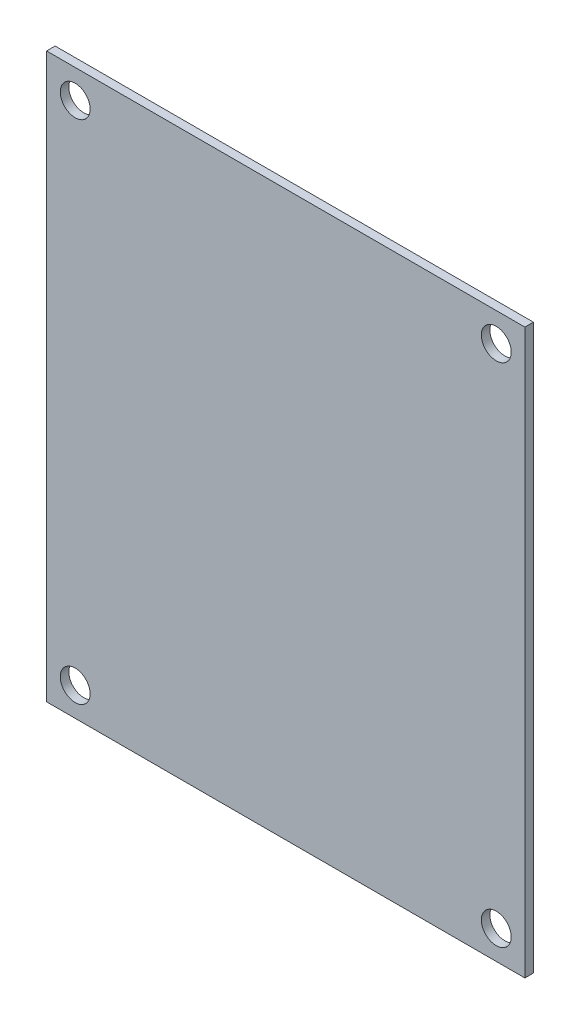
ISO-10303-21;
HEADER;
FILE_DESCRIPTION(('STEP AP214'),'2;1');
FILE_NAME('part.step','',(''),(''),'','','');
FILE_SCHEMA(('AUTOMOTIVE_DESIGN { 1 0 10303 214 1 1 1 1 }'));
ENDSEC;
DATA;
#1=APPLICATION_CONTEXT('core data for automotive mechanical design processes');
#2=APPLICATION_PROTOCOL_DEFINITION('international standard','automotive_design',2000,#1);
#3=PRODUCT_CONTEXT('',#1,'mechanical');
#4=PRODUCT('Part','Part','',(#3));
#5=PRODUCT_RELATED_PRODUCT_CATEGORY('part','',(#4));
#6=PRODUCT_DEFINITION_FORMATION('','',#4);
#7=PRODUCT_DEFINITION_CONTEXT('part definition',#1,'design');
#8=PRODUCT_DEFINITION('design','',#6,#7);
#9=PRODUCT_DEFINITION_SHAPE('','',#8);
#10=(LENGTH_UNIT() NAMED_UNIT(*) SI_UNIT(.MILLI.,.METRE.));
#11=(NAMED_UNIT(*) PLANE_ANGLE_UNIT() SI_UNIT($,.RADIAN.));
#12=(NAMED_UNIT(*) SI_UNIT($,.STERADIAN.) SOLID_ANGLE_UNIT());
#13=UNCERTAINTY_MEASURE_WITH_UNIT(LENGTH_MEASURE(1.E-05),#10,'distance_accuracy_value','');
#14=(GEOMETRIC_REPRESENTATION_CONTEXT(3) GLOBAL_UNCERTAINTY_ASSIGNED_CONTEXT((#13)) GLOBAL_UNIT_ASSIGNED_CONTEXT((#10,
#11,#12)) REPRESENTATION_CONTEXT('',''));
#15=CARTESIAN_POINT('',(0.,0.,0.));
#16=DIRECTION('',(0.,0.,1.));
#17=DIRECTION('',(1.,0.,0.));
#18=AXIS2_PLACEMENT_3D('',#15,#16,#17);
#19=CARTESIAN_POINT('',(0.,0.,1.));
#20=DIRECTION('',(0.,0.,1.));
#21=DIRECTION('',(1.,0.,0.));
#22=AXIS2_PLACEMENT_3D('',#19,#20,#21);
#23=PLANE('',#22);
#24=CARTESIAN_POINT('',(24.65,-29.65,1.));
#25=DIRECTION('',(0.,0.,1.));
#26=DIRECTION('',(1.,0.,0.));
#27=AXIS2_PLACEMENT_3D('',#24,#25,#26);
#28=CIRCLE('',#27,1.75);
#29=CARTESIAN_POINT('',(26.4,-29.65,1.));
#30=VERTEX_POINT('',#29);
#31=EDGE_CURVE('E123',#30,#30,#28,.T.);
#32=ORIENTED_EDGE('',*,*,#31,.F.);
#33=EDGE_LOOP('',(#32));
#34=FACE_BOUND('',#33,.T.);
#35=CARTESIAN_POINT('',(-24.65,29.65,1.));
#36=DIRECTION('',(0.,0.,1.));
#37=DIRECTION('',(1.,0.,0.));
#38=AXIS2_PLACEMENT_3D('',#35,#36,#37);
#39=CIRCLE('',#38,1.75);
#40=CARTESIAN_POINT('',(-22.9,29.65,1.));
#41=VERTEX_POINT('',#40);
#42=EDGE_CURVE('E102',#41,#41,#39,.T.);
#43=ORIENTED_EDGE('',*,*,#42,.F.);
#44=EDGE_LOOP('',(#43));
#45=FACE_BOUND('',#44,.T.);
#46=DIRECTION('',(0.,1.,0.));
#47=VECTOR('',#46,1.);
#48=CARTESIAN_POINT('',(28.,33.,1.));
#49=LINE('',#48,#47);
#50=CARTESIAN_POINT('',(28.,-33.,1.));
#51=VERTEX_POINT('',#50);
#52=CARTESIAN_POINT('',(28.,33.,1.));
#53=VERTEX_POINT('',#52);
#54=EDGE_CURVE('E87',#51,#53,#49,.T.);
#55=ORIENTED_EDGE('',*,*,#54,.T.);
#56=DIRECTION('',(-1.,0.,0.));
#57=VECTOR('',#56,1.);
#58=CARTESIAN_POINT('',(-28.,33.,1.));
#59=LINE('',#58,#57);
#60=CARTESIAN_POINT('',(-28.,33.,1.));
#61=VERTEX_POINT('',#60);
#62=EDGE_CURVE('E82',#53,#61,#59,.T.);
#63=ORIENTED_EDGE('',*,*,#62,.T.);
#64=DIRECTION('',(0.,-1.,0.));
#65=VECTOR('',#64,1.);
#66=CARTESIAN_POINT('',(-28.,33.,1.));
#67=LINE('',#66,#65);
#68=CARTESIAN_POINT('',(-28.,-33.,1.));
#69=VERTEX_POINT('',#68);
#70=EDGE_CURVE('E85',#61,#69,#67,.T.);
#71=ORIENTED_EDGE('',*,*,#70,.T.);
#72=DIRECTION('',(1.,0.,0.));
#73=VECTOR('',#72,1.);
#74=CARTESIAN_POINT('',(-28.,-33.,1.));
#75=LINE('',#74,#73);
#76=EDGE_CURVE('E52',#69,#51,#75,.T.);
#77=ORIENTED_EDGE('',*,*,#76,.T.);
#78=EDGE_LOOP('',(#55,#63,#71,#77));
#79=FACE_BOUND('',#78,.T.);
#80=CARTESIAN_POINT('',(24.65,29.65,1.));
#81=DIRECTION('',(0.,0.,1.));
#82=DIRECTION('',(1.,0.,0.));
#83=AXIS2_PLACEMENT_3D('',#80,#81,#82);
#84=CIRCLE('',#83,1.75);
#85=CARTESIAN_POINT('',(26.4,29.65,1.));
#86=VERTEX_POINT('',#85);
#87=EDGE_CURVE('E117',#86,#86,#84,.T.);
#88=ORIENTED_EDGE('',*,*,#87,.F.);
#89=EDGE_LOOP('',(#88));
#90=FACE_BOUND('',#89,.T.);
#91=CARTESIAN_POINT('',(-24.65,-29.65,1.));
#92=DIRECTION('',(0.,0.,1.));
#93=DIRECTION('',(1.,0.,0.));
#94=AXIS2_PLACEMENT_3D('',#91,#92,#93);
#95=CIRCLE('',#94,1.75);
#96=CARTESIAN_POINT('',(-22.9,-29.65,1.));
#97=VERTEX_POINT('',#96);
#98=EDGE_CURVE('E129',#97,#97,#95,.T.);
#99=ORIENTED_EDGE('',*,*,#98,.F.);
#100=EDGE_LOOP('',(#99));
#101=FACE_BOUND('',#100,.T.);
#102=ADVANCED_FACE('F35',(#34,#45,#79,#90,#101),#23,.T.);
#103=CARTESIAN_POINT('',(0.,0.,0.));
#104=DIRECTION('',(0.,0.,1.));
#105=DIRECTION('',(1.,0.,0.));
#106=AXIS2_PLACEMENT_3D('',#103,#104,#105);
#107=PLANE('',#106);
#108=DIRECTION('',(0.,1.,0.));
#109=VECTOR('',#108,1.);
#110=CARTESIAN_POINT('',(28.,33.,0.));
#111=LINE('',#110,#109);
#112=CARTESIAN_POINT('',(28.,-33.,0.));
#113=VERTEX_POINT('',#112);
#114=CARTESIAN_POINT('',(28.,33.,0.));
#115=VERTEX_POINT('',#114);
#116=EDGE_CURVE('E99',#113,#115,#111,.T.);
#117=ORIENTED_EDGE('',*,*,#116,.F.);
#118=DIRECTION('',(1.,0.,0.));
#119=VECTOR('',#118,1.);
#120=CARTESIAN_POINT('',(-28.,-33.,0.));
#121=LINE('',#120,#119);
#122=CARTESIAN_POINT('',(-28.,-33.,0.));
#123=VERTEX_POINT('',#122);
#124=EDGE_CURVE('E75',#123,#113,#121,.T.);
#125=ORIENTED_EDGE('',*,*,#124,.F.);
#126=DIRECTION('',(0.,-1.,0.));
#127=VECTOR('',#126,1.);
#128=CARTESIAN_POINT('',(-28.,33.,0.));
#129=LINE('',#128,#127);
#130=CARTESIAN_POINT('',(-28.,33.,0.));
#131=VERTEX_POINT('',#130);
#132=EDGE_CURVE('E69',#131,#123,#129,.T.);
#133=ORIENTED_EDGE('',*,*,#132,.F.);
#134=DIRECTION('',(-1.,0.,0.));
#135=VECTOR('',#134,1.);
#136=CARTESIAN_POINT('',(-28.,33.,0.));
#137=LINE('',#136,#135);
#138=EDGE_CURVE('E91',#115,#131,#137,.T.);
#139=ORIENTED_EDGE('',*,*,#138,.F.);
#140=EDGE_LOOP('',(#117,#125,#133,#139));
#141=FACE_BOUND('',#140,.T.);
#142=CARTESIAN_POINT('',(-24.65,29.65,0.));
#143=DIRECTION('',(0.,0.,1.));
#144=DIRECTION('',(1.,0.,0.));
#145=AXIS2_PLACEMENT_3D('',#142,#143,#144);
#146=CIRCLE('',#145,1.75);
#147=CARTESIAN_POINT('',(-22.9,29.65,0.));
#148=VERTEX_POINT('',#147);
#149=EDGE_CURVE('E114',#148,#148,#146,.T.);
#150=ORIENTED_EDGE('',*,*,#149,.T.);
#151=EDGE_LOOP('',(#150));
#152=FACE_BOUND('',#151,.T.);
#153=CARTESIAN_POINT('',(24.65,29.65,0.));
#154=DIRECTION('',(0.,0.,1.));
#155=DIRECTION('',(1.,0.,0.));
#156=AXIS2_PLACEMENT_3D('',#153,#154,#155);
#157=CIRCLE('',#156,1.75);
#158=CARTESIAN_POINT('',(26.4,29.65,0.));
#159=VERTEX_POINT('',#158);
#160=EDGE_CURVE('E120',#159,#159,#157,.T.);
#161=ORIENTED_EDGE('',*,*,#160,.T.);
#162=EDGE_LOOP('',(#161));
#163=FACE_BOUND('',#162,.T.);
#164=CARTESIAN_POINT('',(24.65,-29.65,0.));
#165=DIRECTION('',(0.,0.,1.));
#166=DIRECTION('',(1.,0.,0.));
#167=AXIS2_PLACEMENT_3D('',#164,#165,#166);
#168=CIRCLE('',#167,1.75);
#169=CARTESIAN_POINT('',(26.4,-29.65,0.));
#170=VERTEX_POINT('',#169);
#171=EDGE_CURVE('E126',#170,#170,#168,.T.);
#172=ORIENTED_EDGE('',*,*,#171,.T.);
#173=EDGE_LOOP('',(#172));
#174=FACE_BOUND('',#173,.T.);
#175=CARTESIAN_POINT('',(-24.65,-29.65,0.));
#176=DIRECTION('',(0.,0.,1.));
#177=DIRECTION('',(1.,0.,0.));
#178=AXIS2_PLACEMENT_3D('',#175,#176,#177);
#179=CIRCLE('',#178,1.75);
#180=CARTESIAN_POINT('',(-22.9,-29.65,0.));
#181=VERTEX_POINT('',#180);
#182=EDGE_CURVE('E132',#181,#181,#179,.T.);
#183=ORIENTED_EDGE('',*,*,#182,.T.);
#184=EDGE_LOOP('',(#183));
#185=FACE_BOUND('',#184,.T.);
#186=ADVANCED_FACE('F110',(#141,#152,#163,#174,#185),#107,.F.);
#187=CARTESIAN_POINT('',(28.,33.,1.));
#188=DIRECTION('',(-1.,0.,0.));
#189=DIRECTION('',(0.,-1.,0.));
#190=AXIS2_PLACEMENT_3D('',#187,#188,#189);
#191=PLANE('',#190);
#192=ORIENTED_EDGE('',*,*,#116,.T.);
#193=DIRECTION('',(0.,0.,-1.));
#194=VECTOR('',#193,1.);
#195=CARTESIAN_POINT('',(28.,33.,1.));
#196=LINE('',#195,#194);
#197=EDGE_CURVE('E11',#53,#115,#196,.T.);
#198=ORIENTED_EDGE('',*,*,#197,.F.);
#199=ORIENTED_EDGE('',*,*,#54,.F.);
#200=DIRECTION('',(0.,0.,-1.));
#201=VECTOR('',#200,1.);
#202=CARTESIAN_POINT('',(28.,-33.,1.));
#203=LINE('',#202,#201);
#204=EDGE_CURVE('E95',#51,#113,#203,.T.);
#205=ORIENTED_EDGE('',*,*,#204,.T.);
#206=EDGE_LOOP('',(#192,#198,#199,#205));
#207=FACE_BOUND('',#206,.T.);
#208=ADVANCED_FACE('F37',(#207),#191,.F.);
#209=CARTESIAN_POINT('',(-28.,33.,1.));
#210=DIRECTION('',(0.,-1.,0.));
#211=DIRECTION('',(0.,0.,-1.));
#212=AXIS2_PLACEMENT_3D('',#209,#210,#211);
#213=PLANE('',#212);
#214=ORIENTED_EDGE('',*,*,#138,.T.);
#215=DIRECTION('',(0.,0.,-1.));
#216=VECTOR('',#215,1.);
#217=CARTESIAN_POINT('',(-28.,33.,1.));
#218=LINE('',#217,#216);
#219=EDGE_CURVE('E44',#61,#131,#218,.T.);
#220=ORIENTED_EDGE('',*,*,#219,.F.);
#221=ORIENTED_EDGE('',*,*,#62,.F.);
#222=ORIENTED_EDGE('',*,*,#197,.T.);
#223=EDGE_LOOP('',(#214,#220,#221,#222));
#224=FACE_BOUND('',#223,.T.);
#225=ADVANCED_FACE('F90',(#224),#213,.F.);
#226=CARTESIAN_POINT('',(-28.,33.,1.));
#227=DIRECTION('',(1.,0.,0.));
#228=DIRECTION('',(0.,1.,0.));
#229=AXIS2_PLACEMENT_3D('',#226,#227,#228);
#230=PLANE('',#229);
#231=ORIENTED_EDGE('',*,*,#132,.T.);
#232=DIRECTION('',(0.,0.,-1.));
#233=VECTOR('',#232,1.);
#234=CARTESIAN_POINT('',(-28.,-33.,1.));
#235=LINE('',#234,#233);
#236=EDGE_CURVE('E92',#69,#123,#235,.T.);
#237=ORIENTED_EDGE('',*,*,#236,.F.);
#238=ORIENTED_EDGE('',*,*,#70,.F.);
#239=ORIENTED_EDGE('',*,*,#219,.T.);
#240=EDGE_LOOP('',(#231,#237,#238,#239));
#241=FACE_BOUND('',#240,.T.);
#242=ADVANCED_FACE('F93',(#241),#230,.F.);
#243=CARTESIAN_POINT('',(-28.,-33.,1.));
#244=DIRECTION('',(0.,1.,0.));
#245=DIRECTION('',(0.,0.,1.));
#246=AXIS2_PLACEMENT_3D('',#243,#244,#245);
#247=PLANE('',#246);
#248=ORIENTED_EDGE('',*,*,#124,.T.);
#249=ORIENTED_EDGE('',*,*,#204,.F.);
#250=ORIENTED_EDGE('',*,*,#76,.F.);
#251=ORIENTED_EDGE('',*,*,#236,.T.);
#252=EDGE_LOOP('',(#248,#249,#250,#251));
#253=FACE_BOUND('',#252,.T.);
#254=ADVANCED_FACE('F107',(#253),#247,.F.);
#255=CARTESIAN_POINT('',(-24.65,29.65,1.));
#256=DIRECTION('',(0.,0.,-1.));
#257=DIRECTION('',(-1.,0.,0.));
#258=AXIS2_PLACEMENT_3D('',#255,#256,#257);
#259=CYLINDRICAL_SURFACE('',#258,1.75);
#260=ORIENTED_EDGE('',*,*,#42,.T.);
#261=EDGE_LOOP('',(#260));
#262=FACE_BOUND('',#261,.T.);
#263=ORIENTED_EDGE('',*,*,#149,.F.);
#264=EDGE_LOOP('',(#263));
#265=FACE_BOUND('',#264,.T.);
#266=ADVANCED_FACE('F151',(#262,#265),#259,.F.);
#267=CARTESIAN_POINT('',(24.65,29.65,1.));
#268=DIRECTION('',(0.,0.,-1.));
#269=DIRECTION('',(-1.,0.,0.));
#270=AXIS2_PLACEMENT_3D('',#267,#268,#269);
#271=CYLINDRICAL_SURFACE('',#270,1.75);
#272=ORIENTED_EDGE('',*,*,#87,.T.);
#273=EDGE_LOOP('',(#272));
#274=FACE_BOUND('',#273,.T.);
#275=ORIENTED_EDGE('',*,*,#160,.F.);
#276=EDGE_LOOP('',(#275));
#277=FACE_BOUND('',#276,.T.);
#278=ADVANCED_FACE('F197',(#274,#277),#271,.F.);
#279=CARTESIAN_POINT('',(24.65,-29.65,1.));
#280=DIRECTION('',(0.,0.,-1.));
#281=DIRECTION('',(-1.,0.,0.));
#282=AXIS2_PLACEMENT_3D('',#279,#280,#281);
#283=CYLINDRICAL_SURFACE('',#282,1.75);
#284=ORIENTED_EDGE('',*,*,#31,.T.);
#285=EDGE_LOOP('',(#284));
#286=FACE_BOUND('',#285,.T.);
#287=ORIENTED_EDGE('',*,*,#171,.F.);
#288=EDGE_LOOP('',(#287));
#289=FACE_BOUND('',#288,.T.);
#290=ADVANCED_FACE('F205',(#286,#289),#283,.F.);
#291=CARTESIAN_POINT('',(-24.65,-29.65,1.));
#292=DIRECTION('',(0.,0.,-1.));
#293=DIRECTION('',(-1.,0.,0.));
#294=AXIS2_PLACEMENT_3D('',#291,#292,#293);
#295=CYLINDRICAL_SURFACE('',#294,1.75);
#296=ORIENTED_EDGE('',*,*,#98,.T.);
#297=EDGE_LOOP('',(#296));
#298=FACE_BOUND('',#297,.T.);
#299=ORIENTED_EDGE('',*,*,#182,.F.);
#300=EDGE_LOOP('',(#299));
#301=FACE_BOUND('',#300,.T.);
#302=ADVANCED_FACE('F138',(#298,#301),#295,.F.);
#303=CLOSED_SHELL('',(#102,#186,#208,#225,#242,#254,#266,#278,#290,#302));
#304=MANIFOLD_SOLID_BREP('B2',#303);
#305=ADVANCED_BREP_SHAPE_REPRESENTATION('',(#18,#304),#14);
#306=SHAPE_DEFINITION_REPRESENTATION(#9,#305);
ENDSEC;
END-ISO-10303-21;
